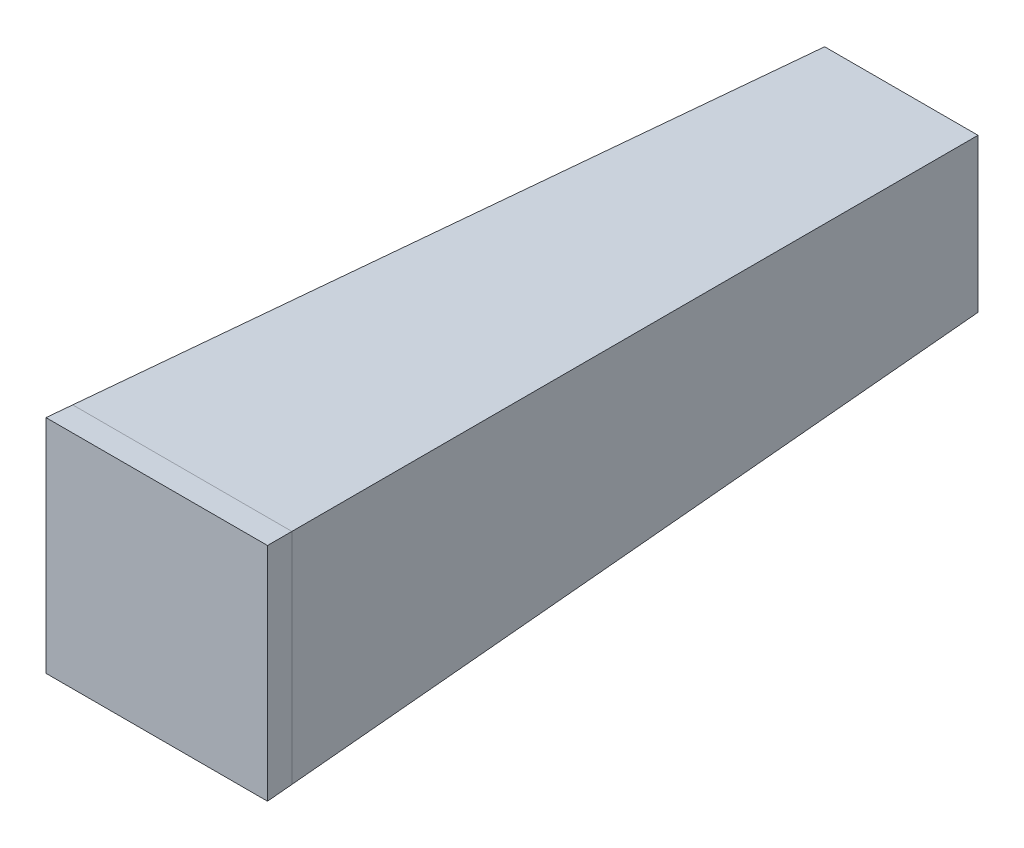
ISO-10303-21;
HEADER;
FILE_DESCRIPTION(('STEP AP214'),'2;1');
FILE_NAME('part.step','',(''),(''),'','','');
FILE_SCHEMA(('AUTOMOTIVE_DESIGN { 1 0 10303 214 1 1 1 1 }'));
ENDSEC;
DATA;
#1=APPLICATION_CONTEXT('core data for automotive mechanical design processes');
#2=APPLICATION_PROTOCOL_DEFINITION('international standard','automotive_design',2000,#1);
#3=PRODUCT_CONTEXT('',#1,'mechanical');
#4=PRODUCT('Part','Part','',(#3));
#5=PRODUCT_RELATED_PRODUCT_CATEGORY('part','',(#4));
#6=PRODUCT_DEFINITION_FORMATION('','',#4);
#7=PRODUCT_DEFINITION_CONTEXT('part definition',#1,'design');
#8=PRODUCT_DEFINITION('design','',#6,#7);
#9=PRODUCT_DEFINITION_SHAPE('','',#8);
#10=(LENGTH_UNIT() NAMED_UNIT(*) SI_UNIT(.MILLI.,.METRE.));
#11=(NAMED_UNIT(*) PLANE_ANGLE_UNIT() SI_UNIT($,.RADIAN.));
#12=(NAMED_UNIT(*) SI_UNIT($,.STERADIAN.) SOLID_ANGLE_UNIT());
#13=UNCERTAINTY_MEASURE_WITH_UNIT(LENGTH_MEASURE(1.E-05),#10,'distance_accuracy_value','');
#14=(GEOMETRIC_REPRESENTATION_CONTEXT(3) GLOBAL_UNCERTAINTY_ASSIGNED_CONTEXT((#13)) GLOBAL_UNIT_ASSIGNED_CONTEXT((#10,
#11,#12)) REPRESENTATION_CONTEXT('',''));
#15=CARTESIAN_POINT('',(0.,0.,0.));
#16=DIRECTION('',(0.,0.,1.));
#17=DIRECTION('',(1.,0.,0.));
#18=AXIS2_PLACEMENT_3D('',#15,#16,#17);
#19=CARTESIAN_POINT('',(0.,0.,844.));
#20=DIRECTION('',(0.,0.,1.));
#21=DIRECTION('',(1.,0.,0.));
#22=AXIS2_PLACEMENT_3D('',#19,#20,#21);
#23=PLANE('',#22);
#24=DIRECTION('',(-1.,0.,0.));
#25=VECTOR('',#24,1.);
#26=CARTESIAN_POINT('',(0.,281.12700228833,844.));
#27=LINE('',#26,#25);
#28=CARTESIAN_POINT('',(281.12700228833,281.127002288329,844.));
#29=VERTEX_POINT('',#28);
#30=CARTESIAN_POINT('',(23.8729977116704,281.12700228833,844.));
#31=VERTEX_POINT('',#30);
#32=EDGE_CURVE('E103',#29,#31,#27,.T.);
#33=ORIENTED_EDGE('',*,*,#32,.T.);
#34=DIRECTION('',(0.,-1.,0.));
#35=VECTOR('',#34,1.);
#36=CARTESIAN_POINT('',(23.8729977116705,0.,844.));
#37=LINE('',#36,#35);
#38=CARTESIAN_POINT('',(23.8729977116705,23.8729977116704,844.));
#39=VERTEX_POINT('',#38);
#40=EDGE_CURVE('E126',#31,#39,#37,.T.);
#41=ORIENTED_EDGE('',*,*,#40,.T.);
#42=DIRECTION('',(1.,0.,0.));
#43=VECTOR('',#42,1.);
#44=CARTESIAN_POINT('',(0.,23.8729977116705,844.));
#45=LINE('',#44,#43);
#46=CARTESIAN_POINT('',(281.12700228833,23.8729977116704,844.));
#47=VERTEX_POINT('',#46);
#48=EDGE_CURVE('E109',#39,#47,#45,.T.);
#49=ORIENTED_EDGE('',*,*,#48,.T.);
#50=DIRECTION('',(0.,1.,0.));
#51=VECTOR('',#50,1.);
#52=CARTESIAN_POINT('',(281.12700228833,1.20043719532443E-13,844.));
#53=LINE('',#52,#51);
#54=EDGE_CURVE('E97',#47,#29,#53,.T.);
#55=ORIENTED_EDGE('',*,*,#54,.T.);
#56=EDGE_LOOP('',(#33,#41,#49,#55));
#57=FACE_BOUND('',#56,.T.);
#58=ADVANCED_FACE('F50',(#57),#23,.T.);
#59=CARTESIAN_POINT('',(62.3693623314121,0.,2.85443305864586));
#60=DIRECTION('',(0.998954351961386,0.,0.0457187346435417));
#61=DIRECTION('',(0.0457187346435417,0.,-0.998954351961386));
#62=AXIS2_PLACEMENT_3D('',#59,#60,#61);
#63=PLANE('',#62);
#64=ORIENTED_EDGE('',*,*,#40,.F.);
#65=DIRECTION('',(-0.045671028705602,0.045671028705602,0.997911977217402));
#66=VECTOR('',#65,1.);
#67=CARTESIAN_POINT('',(62.5,242.5,0.));
#68=LINE('',#67,#66);
#69=CARTESIAN_POINT('',(62.5,242.5,0.));
#70=VERTEX_POINT('',#69);
#71=EDGE_CURVE('E100',#70,#31,#68,.T.);
#72=ORIENTED_EDGE('',*,*,#71,.F.);
#73=DIRECTION('',(0.,1.,0.));
#74=VECTOR('',#73,1.);
#75=CARTESIAN_POINT('',(62.5,242.5,0.));
#76=LINE('',#75,#74);
#77=CARTESIAN_POINT('',(62.5,62.5000000000001,0.));
#78=VERTEX_POINT('',#77);
#79=EDGE_CURVE('E73',#78,#70,#76,.T.);
#80=ORIENTED_EDGE('',*,*,#79,.F.);
#81=DIRECTION('',(-0.0456710287056019,-0.045671028705602,0.997911977217402));
#82=VECTOR('',#81,1.);
#83=CARTESIAN_POINT('',(62.5,62.5,0.));
#84=LINE('',#83,#82);
#85=EDGE_CURVE('E59',#78,#39,#84,.T.);
#86=ORIENTED_EDGE('',*,*,#85,.T.);
#87=EDGE_LOOP('',(#64,#72,#80,#86));
#88=FACE_BOUND('',#87,.T.);
#89=ADVANCED_FACE('F140',(#88),#63,.F.);
#90=CARTESIAN_POINT('',(0.,62.3693623314121,2.85443305864586));
#91=DIRECTION('',(0.,0.998954351961386,0.0457187346435418));
#92=DIRECTION('',(0.,-0.0457187346435418,0.998954351961386));
#93=AXIS2_PLACEMENT_3D('',#90,#91,#92);
#94=PLANE('',#93);
#95=ORIENTED_EDGE('',*,*,#48,.F.);
#96=ORIENTED_EDGE('',*,*,#85,.F.);
#97=DIRECTION('',(-1.,0.,0.));
#98=VECTOR('',#97,1.);
#99=CARTESIAN_POINT('',(242.5,62.5,0.));
#100=LINE('',#99,#98);
#101=CARTESIAN_POINT('',(242.5,62.5,0.));
#102=VERTEX_POINT('',#101);
#103=EDGE_CURVE('E66',#102,#78,#100,.T.);
#104=ORIENTED_EDGE('',*,*,#103,.F.);
#105=DIRECTION('',(0.0456710287056021,-0.0456710287056019,0.997911977217402));
#106=VECTOR('',#105,1.);
#107=CARTESIAN_POINT('',(242.5,62.5,0.));
#108=LINE('',#107,#106);
#109=EDGE_CURVE('E13',#102,#47,#108,.T.);
#110=ORIENTED_EDGE('',*,*,#109,.T.);
#111=EDGE_LOOP('',(#95,#96,#104,#110));
#112=FACE_BOUND('',#111,.T.);
#113=ADVANCED_FACE('F138',(#112),#94,.F.);
#114=CARTESIAN_POINT('',(0.,241.993125845879,-11.075200267546));
#115=DIRECTION('',(0.,-0.998954351961386,0.0457187346435418));
#116=DIRECTION('',(0.,-0.0457187346435418,-0.998954351961386));
#117=AXIS2_PLACEMENT_3D('',#114,#115,#116);
#118=PLANE('',#117);
#119=ORIENTED_EDGE('',*,*,#32,.F.);
#120=DIRECTION('',(0.0456710287056019,0.0456710287056019,0.997911977217402));
#121=VECTOR('',#120,1.);
#122=CARTESIAN_POINT('',(242.5,242.5,0.));
#123=LINE('',#122,#121);
#124=CARTESIAN_POINT('',(242.5,242.5,0.));
#125=VERTEX_POINT('',#124);
#126=EDGE_CURVE('E93',#125,#29,#123,.T.);
#127=ORIENTED_EDGE('',*,*,#126,.F.);
#128=DIRECTION('',(1.,0.,0.));
#129=VECTOR('',#128,1.);
#130=CARTESIAN_POINT('',(242.5,242.5,0.));
#131=LINE('',#130,#129);
#132=EDGE_CURVE('E127',#70,#125,#131,.T.);
#133=ORIENTED_EDGE('',*,*,#132,.F.);
#134=ORIENTED_EDGE('',*,*,#71,.T.);
#135=EDGE_LOOP('',(#119,#127,#133,#134));
#136=FACE_BOUND('',#135,.T.);
#137=ADVANCED_FACE('F104',(#136),#118,.F.);
#138=CARTESIAN_POINT('',(241.993125845879,1.0333320773658E-13,-11.075200267546));
#139=DIRECTION('',(-0.998954351961386,0.,0.0457187346435417));
#140=DIRECTION('',(0.0457187346435417,0.,0.998954351961386));
#141=AXIS2_PLACEMENT_3D('',#138,#139,#140);
#142=PLANE('',#141);
#143=ORIENTED_EDGE('',*,*,#54,.F.);
#144=ORIENTED_EDGE('',*,*,#109,.F.);
#145=DIRECTION('',(0.,-1.,0.));
#146=VECTOR('',#145,1.);
#147=CARTESIAN_POINT('',(242.5,242.5,0.));
#148=LINE('',#147,#146);
#149=EDGE_CURVE('E98',#125,#102,#148,.T.);
#150=ORIENTED_EDGE('',*,*,#149,.F.);
#151=ORIENTED_EDGE('',*,*,#126,.T.);
#152=EDGE_LOOP('',(#143,#144,#150,#151));
#153=FACE_BOUND('',#152,.T.);
#154=ADVANCED_FACE('F52',(#153),#142,.F.);
#155=CARTESIAN_POINT('',(0.,0.,0.));
#156=DIRECTION('',(0.,0.,1.));
#157=DIRECTION('',(1.,0.,0.));
#158=AXIS2_PLACEMENT_3D('',#155,#156,#157);
#159=PLANE('',#158);
#160=ORIENTED_EDGE('',*,*,#149,.T.);
#161=ORIENTED_EDGE('',*,*,#103,.T.);
#162=ORIENTED_EDGE('',*,*,#79,.T.);
#163=ORIENTED_EDGE('',*,*,#132,.T.);
#164=EDGE_LOOP('',(#160,#161,#162,#163));
#165=FACE_BOUND('',#164,.T.);
#166=ADVANCED_FACE('F137',(#165),#159,.F.);
#167=CLOSED_SHELL('',(#58,#89,#113,#137,#154,#166));
#168=MANIFOLD_SOLID_BREP('B2',#167);
#169=CARTESIAN_POINT('',(0.,0.,844.));
#170=DIRECTION('',(0.,0.,1.));
#171=DIRECTION('',(1.,0.,0.));
#172=AXIS2_PLACEMENT_3D('',#169,#170,#171);
#173=PLANE('',#172);
#174=DIRECTION('',(-1.,0.,0.));
#175=VECTOR('',#174,1.);
#176=CARTESIAN_POINT('',(0.,281.12700228833,844.));
#177=LINE('',#176,#175);
#178=CARTESIAN_POINT('',(281.12700228833,281.127002288329,844.));
#179=VERTEX_POINT('',#178);
#180=CARTESIAN_POINT('',(23.8729977116704,281.12700228833,844.));
#181=VERTEX_POINT('',#180);
#182=EDGE_CURVE('E271',#179,#181,#177,.T.);
#183=ORIENTED_EDGE('',*,*,#182,.F.);
#184=DIRECTION('',(0.,1.,0.));
#185=VECTOR('',#184,1.);
#186=CARTESIAN_POINT('',(281.12700228833,1.20043719532443E-13,844.));
#187=LINE('',#186,#185);
#188=CARTESIAN_POINT('',(281.12700228833,23.8729977116704,844.));
#189=VERTEX_POINT('',#188);
#190=EDGE_CURVE('E261',#189,#179,#187,.T.);
#191=ORIENTED_EDGE('',*,*,#190,.F.);
#192=DIRECTION('',(1.,0.,0.));
#193=VECTOR('',#192,1.);
#194=CARTESIAN_POINT('',(0.,23.8729977116705,844.));
#195=LINE('',#194,#193);
#196=CARTESIAN_POINT('',(23.8729977116705,23.8729977116704,844.));
#197=VERTEX_POINT('',#196);
#198=EDGE_CURVE('E196',#197,#189,#195,.T.);
#199=ORIENTED_EDGE('',*,*,#198,.F.);
#200=DIRECTION('',(0.,-1.,0.));
#201=VECTOR('',#200,1.);
#202=CARTESIAN_POINT('',(23.8729977116705,0.,844.));
#203=LINE('',#202,#201);
#204=EDGE_CURVE('E48',#181,#197,#203,.T.);
#205=ORIENTED_EDGE('',*,*,#204,.F.);
#206=EDGE_LOOP('',(#183,#191,#199,#205));
#207=FACE_BOUND('',#206,.T.);
#208=ADVANCED_FACE('F189',(#207),#173,.F.);
#209=CARTESIAN_POINT('',(62.3693623314121,0.,2.85443305864586));
#210=DIRECTION('',(0.998954351961386,0.,0.0457187346435417));
#211=DIRECTION('',(0.0457187346435417,0.,-0.998954351961386));
#212=AXIS2_PLACEMENT_3D('',#209,#210,#211);
#213=PLANE('',#212);
#214=DIRECTION('',(-0.045671028705602,0.045671028705602,0.997911977217402));
#215=VECTOR('',#214,1.);
#216=CARTESIAN_POINT('',(62.5,242.5,0.));
#217=LINE('',#216,#215);
#218=CARTESIAN_POINT('',(22.5,282.5,874.));
#219=VERTEX_POINT('',#218);
#220=EDGE_CURVE('E232',#181,#219,#217,.T.);
#221=ORIENTED_EDGE('',*,*,#220,.F.);
#222=ORIENTED_EDGE('',*,*,#204,.T.);
#223=DIRECTION('',(-0.0456710287056019,-0.045671028705602,0.997911977217402));
#224=VECTOR('',#223,1.);
#225=CARTESIAN_POINT('',(62.5,62.5,0.));
#226=LINE('',#225,#224);
#227=CARTESIAN_POINT('',(22.5,22.5,874.));
#228=VERTEX_POINT('',#227);
#229=EDGE_CURVE('E225',#197,#228,#226,.T.);
#230=ORIENTED_EDGE('',*,*,#229,.T.);
#231=DIRECTION('',(0.,-1.,0.));
#232=VECTOR('',#231,1.);
#233=CARTESIAN_POINT('',(22.5,282.5,874.));
#234=LINE('',#233,#232);
#235=EDGE_CURVE('E228',#219,#228,#234,.T.);
#236=ORIENTED_EDGE('',*,*,#235,.F.);
#237=EDGE_LOOP('',(#221,#222,#230,#236));
#238=FACE_BOUND('',#237,.T.);
#239=ADVANCED_FACE('F227',(#238),#213,.F.);
#240=CARTESIAN_POINT('',(0.,0.,874.));
#241=DIRECTION('',(0.,0.,-1.));
#242=DIRECTION('',(-1.,0.,0.));
#243=AXIS2_PLACEMENT_3D('',#240,#241,#242);
#244=PLANE('',#243);
#245=DIRECTION('',(-1.,0.,0.));
#246=VECTOR('',#245,1.);
#247=CARTESIAN_POINT('',(22.5,282.5,874.));
#248=LINE('',#247,#246);
#249=CARTESIAN_POINT('',(282.5,282.5,874.));
#250=VERTEX_POINT('',#249);
#251=EDGE_CURVE('E242',#250,#219,#248,.T.);
#252=ORIENTED_EDGE('',*,*,#251,.T.);
#253=ORIENTED_EDGE('',*,*,#235,.T.);
#254=DIRECTION('',(1.,0.,0.));
#255=VECTOR('',#254,1.);
#256=CARTESIAN_POINT('',(22.5,22.5,874.));
#257=LINE('',#256,#255);
#258=CARTESIAN_POINT('',(282.5,22.5,874.));
#259=VERTEX_POINT('',#258);
#260=EDGE_CURVE('E239',#228,#259,#257,.T.);
#261=ORIENTED_EDGE('',*,*,#260,.T.);
#262=DIRECTION('',(0.,1.,0.));
#263=VECTOR('',#262,1.);
#264=CARTESIAN_POINT('',(282.5,282.5,874.));
#265=LINE('',#264,#263);
#266=EDGE_CURVE('E246',#259,#250,#265,.T.);
#267=ORIENTED_EDGE('',*,*,#266,.T.);
#268=EDGE_LOOP('',(#252,#253,#261,#267));
#269=FACE_BOUND('',#268,.T.);
#270=ADVANCED_FACE('F237',(#269),#244,.F.);
#271=CARTESIAN_POINT('',(0.,241.993125845879,-11.075200267546));
#272=DIRECTION('',(0.,-0.998954351961386,0.0457187346435418));
#273=DIRECTION('',(0.,-0.0457187346435418,-0.998954351961386));
#274=AXIS2_PLACEMENT_3D('',#271,#272,#273);
#275=PLANE('',#274);
#276=DIRECTION('',(0.0456710287056019,0.0456710287056019,0.997911977217402));
#277=VECTOR('',#276,1.);
#278=CARTESIAN_POINT('',(242.5,242.5,0.));
#279=LINE('',#278,#277);
#280=EDGE_CURVE('E258',#179,#250,#279,.T.);
#281=ORIENTED_EDGE('',*,*,#280,.F.);
#282=ORIENTED_EDGE('',*,*,#182,.T.);
#283=ORIENTED_EDGE('',*,*,#220,.T.);
#284=ORIENTED_EDGE('',*,*,#251,.F.);
#285=EDGE_LOOP('',(#281,#282,#283,#284));
#286=FACE_BOUND('',#285,.T.);
#287=ADVANCED_FACE('F277',(#286),#275,.F.);
#288=CARTESIAN_POINT('',(0.,62.3693623314121,2.85443305864586));
#289=DIRECTION('',(0.,0.998954351961386,0.0457187346435418));
#290=DIRECTION('',(0.,-0.0457187346435418,0.998954351961386));
#291=AXIS2_PLACEMENT_3D('',#288,#289,#290);
#292=PLANE('',#291);
#293=ORIENTED_EDGE('',*,*,#229,.F.);
#294=ORIENTED_EDGE('',*,*,#198,.T.);
#295=DIRECTION('',(0.0456710287056021,-0.0456710287056019,0.997911977217402));
#296=VECTOR('',#295,1.);
#297=CARTESIAN_POINT('',(242.5,62.5,0.));
#298=LINE('',#297,#296);
#299=EDGE_CURVE('E233',#189,#259,#298,.T.);
#300=ORIENTED_EDGE('',*,*,#299,.T.);
#301=ORIENTED_EDGE('',*,*,#260,.F.);
#302=EDGE_LOOP('',(#293,#294,#300,#301));
#303=FACE_BOUND('',#302,.T.);
#304=ADVANCED_FACE('F244',(#303),#292,.F.);
#305=CARTESIAN_POINT('',(241.993125845879,1.0333320773658E-13,-11.075200267546));
#306=DIRECTION('',(-0.998954351961386,0.,0.0457187346435417));
#307=DIRECTION('',(0.0457187346435417,0.,0.998954351961386));
#308=AXIS2_PLACEMENT_3D('',#305,#306,#307);
#309=PLANE('',#308);
#310=ORIENTED_EDGE('',*,*,#299,.F.);
#311=ORIENTED_EDGE('',*,*,#190,.T.);
#312=ORIENTED_EDGE('',*,*,#280,.T.);
#313=ORIENTED_EDGE('',*,*,#266,.F.);
#314=EDGE_LOOP('',(#310,#311,#312,#313));
#315=FACE_BOUND('',#314,.T.);
#316=ADVANCED_FACE('F275',(#315),#309,.F.);
#317=CLOSED_SHELL('',(#208,#239,#270,#287,#304,#316));
#318=MANIFOLD_SOLID_BREP('B7',#317);
#319=ADVANCED_BREP_SHAPE_REPRESENTATION('',(#18,#168,#318),#14);
#320=SHAPE_DEFINITION_REPRESENTATION(#9,#319);
ENDSEC;
END-ISO-10303-21;
